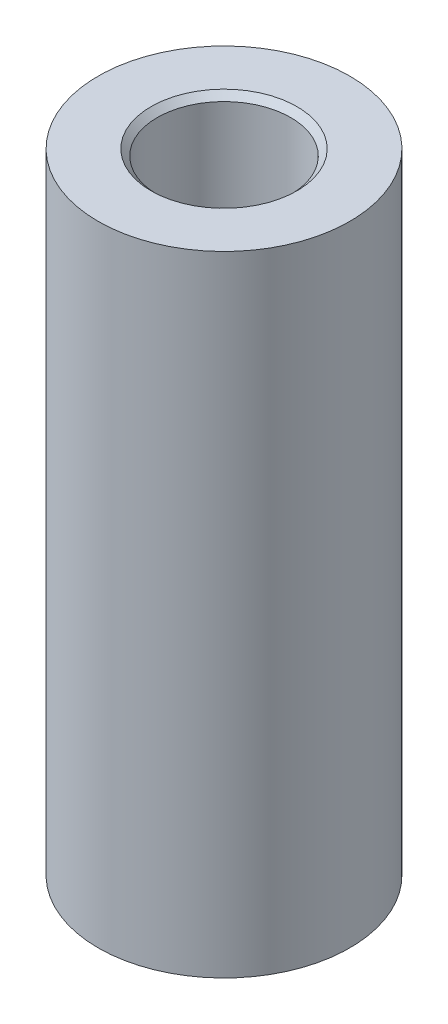
ISO-10303-21;
HEADER;
FILE_DESCRIPTION(('STEP AP214'),'2;1');
FILE_NAME('part.step','',(''),(''),'','','');
FILE_SCHEMA(('AUTOMOTIVE_DESIGN { 1 0 10303 214 1 1 1 1 }'));
ENDSEC;
DATA;
#1=APPLICATION_CONTEXT('core data for automotive mechanical design processes');
#2=APPLICATION_PROTOCOL_DEFINITION('international standard','automotive_design',2000,#1);
#3=PRODUCT_CONTEXT('',#1,'mechanical');
#4=PRODUCT('Part','Part','',(#3));
#5=PRODUCT_RELATED_PRODUCT_CATEGORY('part','',(#4));
#6=PRODUCT_DEFINITION_FORMATION('','',#4);
#7=PRODUCT_DEFINITION_CONTEXT('part definition',#1,'design');
#8=PRODUCT_DEFINITION('design','',#6,#7);
#9=PRODUCT_DEFINITION_SHAPE('','',#8);
#10=(LENGTH_UNIT() NAMED_UNIT(*) SI_UNIT(.MILLI.,.METRE.));
#11=(NAMED_UNIT(*) PLANE_ANGLE_UNIT() SI_UNIT($,.RADIAN.));
#12=(NAMED_UNIT(*) SI_UNIT($,.STERADIAN.) SOLID_ANGLE_UNIT());
#13=UNCERTAINTY_MEASURE_WITH_UNIT(LENGTH_MEASURE(1.E-05),#10,'distance_accuracy_value','');
#14=(GEOMETRIC_REPRESENTATION_CONTEXT(3) GLOBAL_UNCERTAINTY_ASSIGNED_CONTEXT((#13)) GLOBAL_UNIT_ASSIGNED_CONTEXT((#10,
#11,#12)) REPRESENTATION_CONTEXT('',''));
#15=CARTESIAN_POINT('',(0.,0.,0.));
#16=DIRECTION('',(0.,0.,1.));
#17=DIRECTION('',(1.,0.,0.));
#18=AXIS2_PLACEMENT_3D('',#15,#16,#17);
#19=CARTESIAN_POINT('',(0.,12.5,0.));
#20=DIRECTION('',(0.,-1.,0.));
#21=DIRECTION('',(0.,0.,-1.));
#22=AXIS2_PLACEMENT_3D('',#19,#20,#21);
#23=CYLINDRICAL_SURFACE('',#22,5.);
#24=CARTESIAN_POINT('',(0.,12.5,0.));
#25=DIRECTION('',(0.,1.,0.));
#26=DIRECTION('',(0.,0.,1.));
#27=AXIS2_PLACEMENT_3D('',#24,#25,#26);
#28=CIRCLE('',#27,5.);
#29=CARTESIAN_POINT('',(0.,12.5,5.));
#30=VERTEX_POINT('',#29);
#31=EDGE_CURVE('E54',#30,#30,#28,.T.);
#32=ORIENTED_EDGE('',*,*,#31,.F.);
#33=EDGE_LOOP('',(#32));
#34=FACE_BOUND('',#33,.T.);
#35=CARTESIAN_POINT('',(0.,-12.5,0.));
#36=DIRECTION('',(0.,1.,0.));
#37=DIRECTION('',(0.,0.,1.));
#38=AXIS2_PLACEMENT_3D('',#35,#36,#37);
#39=CIRCLE('',#38,5.);
#40=CARTESIAN_POINT('',(0.,-12.5,5.));
#41=VERTEX_POINT('',#40);
#42=EDGE_CURVE('E55',#41,#41,#39,.T.);
#43=ORIENTED_EDGE('',*,*,#42,.T.);
#44=EDGE_LOOP('',(#43));
#45=FACE_BOUND('',#44,.T.);
#46=ADVANCED_FACE('F33',(#34,#45),#23,.T.);
#47=CARTESIAN_POINT('',(0.,12.5,0.));
#48=DIRECTION('',(0.,1.,0.));
#49=DIRECTION('',(0.,0.,1.));
#50=AXIS2_PLACEMENT_3D('',#47,#48,#49);
#51=PLANE('',#50);
#52=CARTESIAN_POINT('',(0.,12.5,0.));
#53=DIRECTION('',(0.,1.,0.));
#54=DIRECTION('',(0.,0.,1.));
#55=AXIS2_PLACEMENT_3D('',#52,#53,#54);
#56=CIRCLE('',#55,2.9);
#57=CARTESIAN_POINT('',(0.,12.5,2.9));
#58=VERTEX_POINT('',#57);
#59=EDGE_CURVE('E41',#58,#58,#56,.F.);
#60=ORIENTED_EDGE('',*,*,#59,.T.);
#61=EDGE_LOOP('',(#60));
#62=FACE_BOUND('',#61,.T.);
#63=ORIENTED_EDGE('',*,*,#31,.T.);
#64=EDGE_LOOP('',(#63));
#65=FACE_BOUND('',#64,.T.);
#66=ADVANCED_FACE('F61',(#62,#65),#51,.T.);
#67=CARTESIAN_POINT('',(0.,-12.5,0.));
#68=DIRECTION('',(0.,1.,0.));
#69=DIRECTION('',(0.,0.,1.));
#70=AXIS2_PLACEMENT_3D('',#67,#68,#69);
#71=PLANE('',#70);
#72=CARTESIAN_POINT('',(0.,-12.5,0.));
#73=DIRECTION('',(0.,1.,0.));
#74=DIRECTION('',(0.,0.,1.));
#75=AXIS2_PLACEMENT_3D('',#72,#73,#74);
#76=CIRCLE('',#75,2.89999999999999);
#77=CARTESIAN_POINT('',(0.,-12.5,2.89999999999999));
#78=VERTEX_POINT('',#77);
#79=EDGE_CURVE('E10',#78,#78,#76,.T.);
#80=ORIENTED_EDGE('',*,*,#79,.T.);
#81=EDGE_LOOP('',(#80));
#82=FACE_BOUND('',#81,.T.);
#83=ORIENTED_EDGE('',*,*,#42,.F.);
#84=EDGE_LOOP('',(#83));
#85=FACE_BOUND('',#84,.T.);
#86=ADVANCED_FACE('F68',(#82,#85),#71,.F.);
#87=CARTESIAN_POINT('',(0.,12.5,0.));
#88=DIRECTION('',(0.,1.,0.));
#89=DIRECTION('',(0.,0.,1.));
#90=AXIS2_PLACEMENT_3D('',#87,#88,#89);
#91=CYLINDRICAL_SURFACE('',#90,2.65);
#92=CARTESIAN_POINT('',(0.,12.25,0.));
#93=DIRECTION('',(0.,1.,0.));
#94=DIRECTION('',(0.,0.,1.));
#95=AXIS2_PLACEMENT_3D('',#92,#93,#94);
#96=CIRCLE('',#95,2.65);
#97=CARTESIAN_POINT('',(0.,12.25,2.65));
#98=VERTEX_POINT('',#97);
#99=EDGE_CURVE('E45',#98,#98,#96,.T.);
#100=ORIENTED_EDGE('',*,*,#99,.T.);
#101=EDGE_LOOP('',(#100));
#102=FACE_BOUND('',#101,.T.);
#103=CARTESIAN_POINT('',(0.,-12.25,0.));
#104=DIRECTION('',(0.,1.,0.));
#105=DIRECTION('',(0.,0.,1.));
#106=AXIS2_PLACEMENT_3D('',#103,#104,#105);
#107=CIRCLE('',#106,2.65);
#108=CARTESIAN_POINT('',(0.,-12.25,2.65));
#109=VERTEX_POINT('',#108);
#110=EDGE_CURVE('E49',#109,#109,#107,.F.);
#111=ORIENTED_EDGE('',*,*,#110,.T.);
#112=EDGE_LOOP('',(#111));
#113=FACE_BOUND('',#112,.T.);
#114=ADVANCED_FACE('F70',(#102,#113),#91,.F.);
#115=CARTESIAN_POINT('',(0.,12.25,0.));
#116=DIRECTION('',(0.,1.,0.));
#117=DIRECTION('',(0.,0.,1.));
#118=AXIS2_PLACEMENT_3D('',#115,#116,#117);
#119=CONICAL_SURFACE('',#118,2.65,0.785398163397455);
#120=ORIENTED_EDGE('',*,*,#59,.F.);
#121=EDGE_LOOP('',(#120));
#122=FACE_BOUND('',#121,.T.);
#123=ORIENTED_EDGE('',*,*,#99,.F.);
#124=EDGE_LOOP('',(#123));
#125=FACE_BOUND('',#124,.T.);
#126=ADVANCED_FACE('F76',(#122,#125),#119,.F.);
#127=CARTESIAN_POINT('',(0.,-12.5,0.));
#128=DIRECTION('',(0.,-1.,0.));
#129=DIRECTION('',(0.,0.,-1.));
#130=AXIS2_PLACEMENT_3D('',#127,#128,#129);
#131=CONICAL_SURFACE('',#130,2.89999999999999,0.785398163397445);
#132=ORIENTED_EDGE('',*,*,#110,.F.);
#133=EDGE_LOOP('',(#132));
#134=FACE_BOUND('',#133,.T.);
#135=ORIENTED_EDGE('',*,*,#79,.F.);
#136=EDGE_LOOP('',(#135));
#137=FACE_BOUND('',#136,.T.);
#138=ADVANCED_FACE('F36',(#134,#137),#131,.F.);
#139=CLOSED_SHELL('',(#46,#66,#86,#114,#126,#138));
#140=MANIFOLD_SOLID_BREP('B2',#139);
#141=ADVANCED_BREP_SHAPE_REPRESENTATION('',(#18,#140),#14);
#142=SHAPE_DEFINITION_REPRESENTATION(#9,#141);
ENDSEC;
END-ISO-10303-21;
